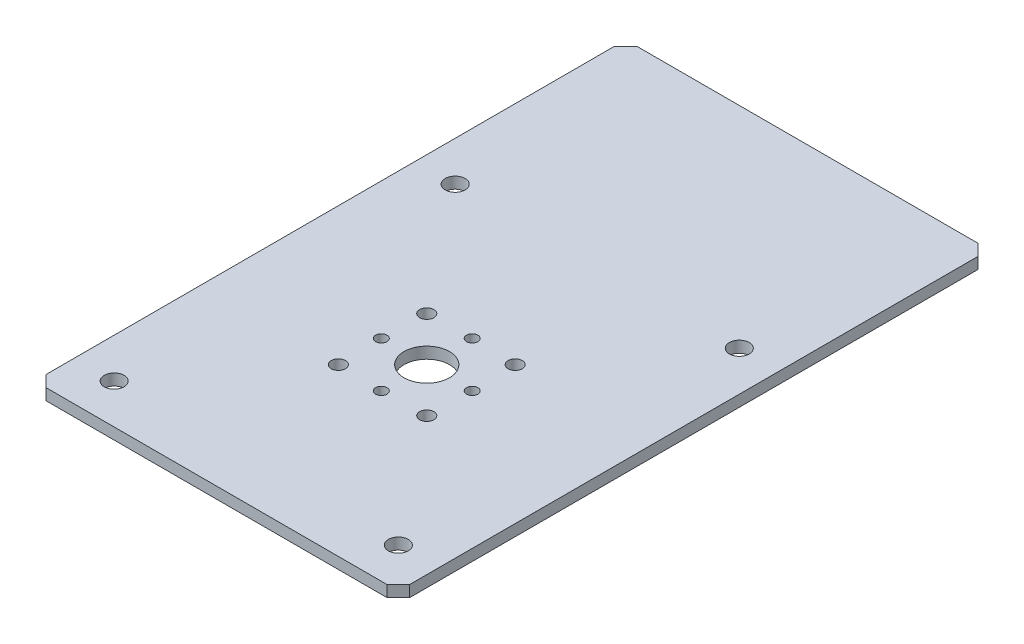
ISO-10303-21;
HEADER;
FILE_DESCRIPTION(('STEP AP214'),'2;1');
FILE_NAME('part.step','',(''),(''),'','','');
FILE_SCHEMA(('AUTOMOTIVE_DESIGN { 1 0 10303 214 1 1 1 1 }'));
ENDSEC;
DATA;
#1=APPLICATION_CONTEXT('core data for automotive mechanical design processes');
#2=APPLICATION_PROTOCOL_DEFINITION('international standard','automotive_design',2000,#1);
#3=PRODUCT_CONTEXT('',#1,'mechanical');
#4=PRODUCT('Part','Part','',(#3));
#5=PRODUCT_RELATED_PRODUCT_CATEGORY('part','',(#4));
#6=PRODUCT_DEFINITION_FORMATION('','',#4);
#7=PRODUCT_DEFINITION_CONTEXT('part definition',#1,'design');
#8=PRODUCT_DEFINITION('design','',#6,#7);
#9=PRODUCT_DEFINITION_SHAPE('','',#8);
#10=(LENGTH_UNIT() NAMED_UNIT(*) SI_UNIT(.MILLI.,.METRE.));
#11=(NAMED_UNIT(*) PLANE_ANGLE_UNIT() SI_UNIT($,.RADIAN.));
#12=(NAMED_UNIT(*) SI_UNIT($,.STERADIAN.) SOLID_ANGLE_UNIT());
#13=UNCERTAINTY_MEASURE_WITH_UNIT(LENGTH_MEASURE(1.E-05),#10,'distance_accuracy_value','');
#14=(GEOMETRIC_REPRESENTATION_CONTEXT(3) GLOBAL_UNCERTAINTY_ASSIGNED_CONTEXT((#13)) GLOBAL_UNIT_ASSIGNED_CONTEXT((#10,
#11,#12)) REPRESENTATION_CONTEXT('',''));
#15=CARTESIAN_POINT('',(0.,0.,0.));
#16=DIRECTION('',(0.,0.,1.));
#17=DIRECTION('',(1.,0.,0.));
#18=AXIS2_PLACEMENT_3D('',#15,#16,#17);
#19=CARTESIAN_POINT('',(-32.,-2.,74.));
#20=DIRECTION('',(0.,1.,0.));
#21=DIRECTION('',(0.,0.,1.));
#22=AXIS2_PLACEMENT_3D('',#19,#20,#21);
#23=PLANE('',#22);
#24=CARTESIAN_POINT('',(7.77817459305199,-2.,44.778174593052));
#25=DIRECTION('',(0.,1.,0.));
#26=DIRECTION('',(0.,0.,1.));
#27=AXIS2_PLACEMENT_3D('',#24,#25,#26);
#28=CIRCLE('',#27,1.25);
#29=CARTESIAN_POINT('',(7.77817459305199,-2.,46.028174593052));
#30=VERTEX_POINT('',#29);
#31=EDGE_CURVE('E167',#30,#30,#28,.F.);
#32=ORIENTED_EDGE('',*,*,#31,.F.);
#33=EDGE_LOOP('',(#32));
#34=FACE_BOUND('',#33,.T.);
#35=CARTESIAN_POINT('',(7.77817459305199,-2.,29.221825406948));
#36=DIRECTION('',(0.,1.,0.));
#37=DIRECTION('',(0.,0.,1.));
#38=AXIS2_PLACEMENT_3D('',#35,#36,#37);
#39=CIRCLE('',#38,1.25);
#40=CARTESIAN_POINT('',(7.77817459305199,-2.,30.471825406948));
#41=VERTEX_POINT('',#40);
#42=EDGE_CURVE('E173',#41,#41,#39,.F.);
#43=ORIENTED_EDGE('',*,*,#42,.F.);
#44=EDGE_LOOP('',(#43));
#45=FACE_BOUND('',#44,.T.);
#46=CARTESIAN_POINT('',(-7.77817459305201,-2.,29.221825406948));
#47=DIRECTION('',(0.,1.,0.));
#48=DIRECTION('',(0.,0.,1.));
#49=AXIS2_PLACEMENT_3D('',#46,#47,#48);
#50=CIRCLE('',#49,1.25);
#51=CARTESIAN_POINT('',(-7.77817459305201,-2.,30.471825406948));
#52=VERTEX_POINT('',#51);
#53=EDGE_CURVE('E179',#52,#52,#50,.F.);
#54=ORIENTED_EDGE('',*,*,#53,.F.);
#55=EDGE_LOOP('',(#54));
#56=FACE_BOUND('',#55,.T.);
#57=CARTESIAN_POINT('',(-7.77817459305201,-2.,44.778174593052));
#58=DIRECTION('',(0.,1.,0.));
#59=DIRECTION('',(0.,0.,1.));
#60=AXIS2_PLACEMENT_3D('',#57,#58,#59);
#61=CIRCLE('',#60,1.25);
#62=CARTESIAN_POINT('',(-7.77817459305201,-2.,46.028174593052));
#63=VERTEX_POINT('',#62);
#64=EDGE_CURVE('E185',#63,#63,#61,.F.);
#65=ORIENTED_EDGE('',*,*,#64,.F.);
#66=EDGE_LOOP('',(#65));
#67=FACE_BOUND('',#66,.T.);
#68=CARTESIAN_POINT('',(0.,-2.,29.));
#69=DIRECTION('',(0.,1.,0.));
#70=DIRECTION('',(0.,0.,1.));
#71=AXIS2_PLACEMENT_3D('',#68,#69,#70);
#72=CIRCLE('',#71,1.);
#73=CARTESIAN_POINT('',(0.,-2.,30.));
#74=VERTEX_POINT('',#73);
#75=EDGE_CURVE('E191',#74,#74,#72,.F.);
#76=ORIENTED_EDGE('',*,*,#75,.F.);
#77=EDGE_LOOP('',(#76));
#78=FACE_BOUND('',#77,.T.);
#79=CARTESIAN_POINT('',(0.,-2.,45.));
#80=DIRECTION('',(0.,1.,0.));
#81=DIRECTION('',(0.,0.,1.));
#82=AXIS2_PLACEMENT_3D('',#79,#80,#81);
#83=CIRCLE('',#82,0.999999999999992);
#84=CARTESIAN_POINT('',(0.,-2.,46.));
#85=VERTEX_POINT('',#84);
#86=EDGE_CURVE('E197',#85,#85,#83,.F.);
#87=ORIENTED_EDGE('',*,*,#86,.F.);
#88=EDGE_LOOP('',(#87));
#89=FACE_BOUND('',#88,.T.);
#90=CARTESIAN_POINT('',(7.99999999999999,-2.,37.));
#91=DIRECTION('',(0.,1.,0.));
#92=DIRECTION('',(0.,0.,1.));
#93=AXIS2_PLACEMENT_3D('',#90,#91,#92);
#94=CIRCLE('',#93,1.00000000000001);
#95=CARTESIAN_POINT('',(7.99999999999999,-2.,38.));
#96=VERTEX_POINT('',#95);
#97=EDGE_CURVE('E203',#96,#96,#94,.F.);
#98=ORIENTED_EDGE('',*,*,#97,.F.);
#99=EDGE_LOOP('',(#98));
#100=FACE_BOUND('',#99,.T.);
#101=CARTESIAN_POINT('',(-8.00000000000001,-2.,37.));
#102=DIRECTION('',(0.,1.,0.));
#103=DIRECTION('',(0.,0.,1.));
#104=AXIS2_PLACEMENT_3D('',#101,#102,#103);
#105=CIRCLE('',#104,1.00000000000001);
#106=CARTESIAN_POINT('',(-8.00000000000001,-2.,38.));
#107=VERTEX_POINT('',#106);
#108=EDGE_CURVE('E209',#107,#107,#105,.F.);
#109=ORIENTED_EDGE('',*,*,#108,.F.);
#110=EDGE_LOOP('',(#109));
#111=FACE_BOUND('',#110,.T.);
#112=CARTESIAN_POINT('',(0.,-2.,37.));
#113=DIRECTION('',(0.,1.,0.));
#114=DIRECTION('',(0.,0.,1.));
#115=AXIS2_PLACEMENT_3D('',#112,#113,#114);
#116=CIRCLE('',#115,4.00000000000001);
#117=CARTESIAN_POINT('',(0.,-2.,41.));
#118=VERTEX_POINT('',#117);
#119=EDGE_CURVE('E215',#118,#118,#116,.F.);
#120=ORIENTED_EDGE('',*,*,#119,.F.);
#121=EDGE_LOOP('',(#120));
#122=FACE_BOUND('',#121,.T.);
#123=CARTESIAN_POINT('',(25.,-2.,7.00000000000001));
#124=DIRECTION('',(0.,1.,0.));
#125=DIRECTION('',(0.,0.,1.));
#126=AXIS2_PLACEMENT_3D('',#123,#124,#125);
#127=CIRCLE('',#126,1.75);
#128=CARTESIAN_POINT('',(25.,-2.,8.75000000000001));
#129=VERTEX_POINT('',#128);
#130=EDGE_CURVE('E221',#129,#129,#127,.T.);
#131=ORIENTED_EDGE('',*,*,#130,.T.);
#132=EDGE_LOOP('',(#131));
#133=FACE_BOUND('',#132,.T.);
#134=CARTESIAN_POINT('',(25.,-2.,67.));
#135=DIRECTION('',(0.,1.,0.));
#136=DIRECTION('',(0.,0.,1.));
#137=AXIS2_PLACEMENT_3D('',#134,#135,#136);
#138=CIRCLE('',#137,1.75);
#139=CARTESIAN_POINT('',(25.,-2.,68.75));
#140=VERTEX_POINT('',#139);
#141=EDGE_CURVE('E227',#140,#140,#138,.T.);
#142=ORIENTED_EDGE('',*,*,#141,.T.);
#143=EDGE_LOOP('',(#142));
#144=FACE_BOUND('',#143,.T.);
#145=CARTESIAN_POINT('',(-25.,-2.,67.));
#146=DIRECTION('',(0.,1.,0.));
#147=DIRECTION('',(0.,0.,1.));
#148=AXIS2_PLACEMENT_3D('',#145,#146,#147);
#149=CIRCLE('',#148,1.75);
#150=CARTESIAN_POINT('',(-25.,-2.,68.75));
#151=VERTEX_POINT('',#150);
#152=EDGE_CURVE('E233',#151,#151,#149,.T.);
#153=ORIENTED_EDGE('',*,*,#152,.T.);
#154=EDGE_LOOP('',(#153));
#155=FACE_BOUND('',#154,.T.);
#156=CARTESIAN_POINT('',(-25.,-2.,7.00000000000001));
#157=DIRECTION('',(0.,1.,0.));
#158=DIRECTION('',(0.,0.,1.));
#159=AXIS2_PLACEMENT_3D('',#156,#157,#158);
#160=CIRCLE('',#159,1.75);
#161=CARTESIAN_POINT('',(-25.,-2.,8.75000000000001));
#162=VERTEX_POINT('',#161);
#163=EDGE_CURVE('E239',#162,#162,#160,.T.);
#164=ORIENTED_EDGE('',*,*,#163,.T.);
#165=EDGE_LOOP('',(#164));
#166=FACE_BOUND('',#165,.T.);
#167=DIRECTION('',(-1.,0.,0.));
#168=VECTOR('',#167,1.);
#169=CARTESIAN_POINT('',(-32.,-2.,-30.));
#170=LINE('',#169,#168);
#171=CARTESIAN_POINT('',(30.,-2.,-30.));
#172=VERTEX_POINT('',#171);
#173=CARTESIAN_POINT('',(-30.,-2.,-30.));
#174=VERTEX_POINT('',#173);
#175=EDGE_CURVE('E151',#172,#174,#170,.T.);
#176=ORIENTED_EDGE('',*,*,#175,.F.);
#177=DIRECTION('',(-0.707106781186548,0.,-0.707106781186548));
#178=VECTOR('',#177,1.);
#179=CARTESIAN_POINT('',(32.,-2.,-28.));
#180=LINE('',#179,#178);
#181=CARTESIAN_POINT('',(32.,-2.,-28.));
#182=VERTEX_POINT('',#181);
#183=EDGE_CURVE('E42',#172,#182,#180,.F.);
#184=ORIENTED_EDGE('',*,*,#183,.T.);
#185=DIRECTION('',(0.,0.,-1.));
#186=VECTOR('',#185,1.);
#187=CARTESIAN_POINT('',(32.,-2.,74.));
#188=LINE('',#187,#186);
#189=CARTESIAN_POINT('',(32.,-2.,72.));
#190=VERTEX_POINT('',#189);
#191=EDGE_CURVE('E122',#190,#182,#188,.T.);
#192=ORIENTED_EDGE('',*,*,#191,.F.);
#193=DIRECTION('',(-0.70710678118655,0.,0.707106781186545));
#194=VECTOR('',#193,1.);
#195=CARTESIAN_POINT('',(32.,-2.,72.));
#196=LINE('',#195,#194);
#197=CARTESIAN_POINT('',(30.,-2.,74.));
#198=VERTEX_POINT('',#197);
#199=EDGE_CURVE('E126',#190,#198,#196,.T.);
#200=ORIENTED_EDGE('',*,*,#199,.T.);
#201=DIRECTION('',(1.,0.,0.));
#202=VECTOR('',#201,1.);
#203=CARTESIAN_POINT('',(-32.,-2.,74.));
#204=LINE('',#203,#202);
#205=CARTESIAN_POINT('',(-30.,-2.,74.));
#206=VERTEX_POINT('',#205);
#207=EDGE_CURVE('E242',#206,#198,#204,.T.);
#208=ORIENTED_EDGE('',*,*,#207,.F.);
#209=DIRECTION('',(-0.70710678118655,0.,-0.707106781186545));
#210=VECTOR('',#209,1.);
#211=CARTESIAN_POINT('',(-32.,-2.,72.));
#212=LINE('',#211,#210);
#213=CARTESIAN_POINT('',(-32.,-2.,72.));
#214=VERTEX_POINT('',#213);
#215=EDGE_CURVE('E127',#206,#214,#212,.T.);
#216=ORIENTED_EDGE('',*,*,#215,.T.);
#217=DIRECTION('',(0.,0.,-1.));
#218=VECTOR('',#217,1.);
#219=CARTESIAN_POINT('',(-32.,-2.,74.));
#220=LINE('',#219,#218);
#221=CARTESIAN_POINT('',(-32.,-2.,-28.));
#222=VERTEX_POINT('',#221);
#223=EDGE_CURVE('E246',#214,#222,#220,.T.);
#224=ORIENTED_EDGE('',*,*,#223,.T.);
#225=DIRECTION('',(-0.707106781186548,0.,0.707106781186548));
#226=VECTOR('',#225,1.);
#227=CARTESIAN_POINT('',(-30.,-2.,-30.));
#228=LINE('',#227,#226);
#229=EDGE_CURVE('E54',#222,#174,#228,.F.);
#230=ORIENTED_EDGE('',*,*,#229,.T.);
#231=EDGE_LOOP('',(#176,#184,#192,#200,#208,#216,#224,#230));
#232=FACE_BOUND('',#231,.T.);
#233=ADVANCED_FACE('F34',(#34,#45,#56,#67,#78,#89,#100,#111,#122,#133,#144,#155,#166,#232),#23,.F.);
#234=CARTESIAN_POINT('',(32.,0.,74.));
#235=DIRECTION('',(1.,0.,0.));
#236=DIRECTION('',(0.,0.,-1.));
#237=AXIS2_PLACEMENT_3D('',#234,#235,#236);
#238=PLANE('',#237);
#239=ORIENTED_EDGE('',*,*,#191,.T.);
#240=DIRECTION('',(0.,1.,0.));
#241=VECTOR('',#240,1.);
#242=CARTESIAN_POINT('',(32.,0.,-28.));
#243=LINE('',#242,#241);
#244=CARTESIAN_POINT('',(32.,0.,-28.));
#245=VERTEX_POINT('',#244);
#246=EDGE_CURVE('E121',#182,#245,#243,.T.);
#247=ORIENTED_EDGE('',*,*,#246,.T.);
#248=DIRECTION('',(0.,0.,-1.));
#249=VECTOR('',#248,1.);
#250=CARTESIAN_POINT('',(32.,0.,74.));
#251=LINE('',#250,#249);
#252=CARTESIAN_POINT('',(32.,0.,72.));
#253=VERTEX_POINT('',#252);
#254=EDGE_CURVE('E104',#253,#245,#251,.T.);
#255=ORIENTED_EDGE('',*,*,#254,.F.);
#256=DIRECTION('',(0.,-1.,0.));
#257=VECTOR('',#256,1.);
#258=CARTESIAN_POINT('',(32.,-2.,72.));
#259=LINE('',#258,#257);
#260=EDGE_CURVE('E118',#253,#190,#259,.T.);
#261=ORIENTED_EDGE('',*,*,#260,.T.);
#262=EDGE_LOOP('',(#239,#247,#255,#261));
#263=FACE_BOUND('',#262,.T.);
#264=ADVANCED_FACE('F117',(#263),#238,.T.);
#265=CARTESIAN_POINT('',(-32.,0.,74.));
#266=DIRECTION('',(0.,1.,0.));
#267=DIRECTION('',(0.,0.,1.));
#268=AXIS2_PLACEMENT_3D('',#265,#266,#267);
#269=PLANE('',#268);
#270=CARTESIAN_POINT('',(7.77817459305199,0.,44.778174593052));
#271=DIRECTION('',(0.,1.,0.));
#272=DIRECTION('',(0.,0.,1.));
#273=AXIS2_PLACEMENT_3D('',#270,#271,#272);
#274=CIRCLE('',#273,1.25);
#275=CARTESIAN_POINT('',(7.77817459305199,0.,46.028174593052));
#276=VERTEX_POINT('',#275);
#277=EDGE_CURVE('E162',#276,#276,#274,.T.);
#278=ORIENTED_EDGE('',*,*,#277,.F.);
#279=EDGE_LOOP('',(#278));
#280=FACE_BOUND('',#279,.T.);
#281=CARTESIAN_POINT('',(7.77817459305199,0.,29.221825406948));
#282=DIRECTION('',(0.,1.,0.));
#283=DIRECTION('',(0.,0.,1.));
#284=AXIS2_PLACEMENT_3D('',#281,#282,#283);
#285=CIRCLE('',#284,1.25);
#286=CARTESIAN_POINT('',(7.77817459305199,0.,30.471825406948));
#287=VERTEX_POINT('',#286);
#288=EDGE_CURVE('E170',#287,#287,#285,.T.);
#289=ORIENTED_EDGE('',*,*,#288,.F.);
#290=EDGE_LOOP('',(#289));
#291=FACE_BOUND('',#290,.T.);
#292=CARTESIAN_POINT('',(-7.77817459305201,0.,29.221825406948));
#293=DIRECTION('',(0.,1.,0.));
#294=DIRECTION('',(0.,0.,1.));
#295=AXIS2_PLACEMENT_3D('',#292,#293,#294);
#296=CIRCLE('',#295,1.25);
#297=CARTESIAN_POINT('',(-7.77817459305201,0.,30.471825406948));
#298=VERTEX_POINT('',#297);
#299=EDGE_CURVE('E176',#298,#298,#296,.T.);
#300=ORIENTED_EDGE('',*,*,#299,.F.);
#301=EDGE_LOOP('',(#300));
#302=FACE_BOUND('',#301,.T.);
#303=CARTESIAN_POINT('',(-7.77817459305201,0.,44.778174593052));
#304=DIRECTION('',(0.,1.,0.));
#305=DIRECTION('',(0.,0.,1.));
#306=AXIS2_PLACEMENT_3D('',#303,#304,#305);
#307=CIRCLE('',#306,1.25);
#308=CARTESIAN_POINT('',(-7.77817459305201,0.,46.028174593052));
#309=VERTEX_POINT('',#308);
#310=EDGE_CURVE('E182',#309,#309,#307,.T.);
#311=ORIENTED_EDGE('',*,*,#310,.F.);
#312=EDGE_LOOP('',(#311));
#313=FACE_BOUND('',#312,.T.);
#314=CARTESIAN_POINT('',(0.,0.,29.));
#315=DIRECTION('',(0.,1.,0.));
#316=DIRECTION('',(0.,0.,1.));
#317=AXIS2_PLACEMENT_3D('',#314,#315,#316);
#318=CIRCLE('',#317,1.);
#319=CARTESIAN_POINT('',(0.,0.,30.));
#320=VERTEX_POINT('',#319);
#321=EDGE_CURVE('E188',#320,#320,#318,.T.);
#322=ORIENTED_EDGE('',*,*,#321,.F.);
#323=EDGE_LOOP('',(#322));
#324=FACE_BOUND('',#323,.T.);
#325=CARTESIAN_POINT('',(0.,0.,45.));
#326=DIRECTION('',(0.,1.,0.));
#327=DIRECTION('',(0.,0.,1.));
#328=AXIS2_PLACEMENT_3D('',#325,#326,#327);
#329=CIRCLE('',#328,0.999999999999992);
#330=CARTESIAN_POINT('',(0.,0.,46.));
#331=VERTEX_POINT('',#330);
#332=EDGE_CURVE('E194',#331,#331,#329,.T.);
#333=ORIENTED_EDGE('',*,*,#332,.F.);
#334=EDGE_LOOP('',(#333));
#335=FACE_BOUND('',#334,.T.);
#336=CARTESIAN_POINT('',(7.99999999999999,0.,37.));
#337=DIRECTION('',(0.,1.,0.));
#338=DIRECTION('',(0.,0.,1.));
#339=AXIS2_PLACEMENT_3D('',#336,#337,#338);
#340=CIRCLE('',#339,1.00000000000001);
#341=CARTESIAN_POINT('',(7.99999999999999,0.,38.));
#342=VERTEX_POINT('',#341);
#343=EDGE_CURVE('E200',#342,#342,#340,.T.);
#344=ORIENTED_EDGE('',*,*,#343,.F.);
#345=EDGE_LOOP('',(#344));
#346=FACE_BOUND('',#345,.T.);
#347=CARTESIAN_POINT('',(-8.00000000000001,0.,37.));
#348=DIRECTION('',(0.,1.,0.));
#349=DIRECTION('',(0.,0.,1.));
#350=AXIS2_PLACEMENT_3D('',#347,#348,#349);
#351=CIRCLE('',#350,1.00000000000001);
#352=CARTESIAN_POINT('',(-8.00000000000001,0.,38.));
#353=VERTEX_POINT('',#352);
#354=EDGE_CURVE('E206',#353,#353,#351,.T.);
#355=ORIENTED_EDGE('',*,*,#354,.F.);
#356=EDGE_LOOP('',(#355));
#357=FACE_BOUND('',#356,.T.);
#358=CARTESIAN_POINT('',(0.,0.,37.));
#359=DIRECTION('',(0.,1.,0.));
#360=DIRECTION('',(0.,0.,1.));
#361=AXIS2_PLACEMENT_3D('',#358,#359,#360);
#362=CIRCLE('',#361,4.00000000000001);
#363=CARTESIAN_POINT('',(0.,0.,41.));
#364=VERTEX_POINT('',#363);
#365=EDGE_CURVE('E212',#364,#364,#362,.T.);
#366=ORIENTED_EDGE('',*,*,#365,.F.);
#367=EDGE_LOOP('',(#366));
#368=FACE_BOUND('',#367,.T.);
#369=CARTESIAN_POINT('',(25.,0.,7.00000000000001));
#370=DIRECTION('',(0.,1.,0.));
#371=DIRECTION('',(0.,0.,-1.));
#372=AXIS2_PLACEMENT_3D('',#369,#370,#371);
#373=CIRCLE('',#372,1.75);
#374=CARTESIAN_POINT('',(25.,0.,5.25000000000001));
#375=VERTEX_POINT('',#374);
#376=EDGE_CURVE('E218',#375,#375,#373,.T.);
#377=ORIENTED_EDGE('',*,*,#376,.F.);
#378=EDGE_LOOP('',(#377));
#379=FACE_BOUND('',#378,.T.);
#380=CARTESIAN_POINT('',(25.,0.,67.));
#381=DIRECTION('',(0.,1.,0.));
#382=DIRECTION('',(0.,0.,1.));
#383=AXIS2_PLACEMENT_3D('',#380,#381,#382);
#384=CIRCLE('',#383,1.75);
#385=CARTESIAN_POINT('',(25.,0.,68.75));
#386=VERTEX_POINT('',#385);
#387=EDGE_CURVE('E224',#386,#386,#384,.T.);
#388=ORIENTED_EDGE('',*,*,#387,.F.);
#389=EDGE_LOOP('',(#388));
#390=FACE_BOUND('',#389,.T.);
#391=CARTESIAN_POINT('',(-25.,0.,67.));
#392=DIRECTION('',(0.,1.,0.));
#393=DIRECTION('',(0.,0.,-1.));
#394=AXIS2_PLACEMENT_3D('',#391,#392,#393);
#395=CIRCLE('',#394,1.75);
#396=CARTESIAN_POINT('',(-25.,0.,65.25));
#397=VERTEX_POINT('',#396);
#398=EDGE_CURVE('E230',#397,#397,#395,.T.);
#399=ORIENTED_EDGE('',*,*,#398,.F.);
#400=EDGE_LOOP('',(#399));
#401=FACE_BOUND('',#400,.T.);
#402=CARTESIAN_POINT('',(-25.,0.,7.00000000000001));
#403=DIRECTION('',(0.,1.,0.));
#404=DIRECTION('',(0.,0.,1.));
#405=AXIS2_PLACEMENT_3D('',#402,#403,#404);
#406=CIRCLE('',#405,1.75);
#407=CARTESIAN_POINT('',(-25.,0.,8.75000000000001));
#408=VERTEX_POINT('',#407);
#409=EDGE_CURVE('E236',#408,#408,#406,.T.);
#410=ORIENTED_EDGE('',*,*,#409,.F.);
#411=EDGE_LOOP('',(#410));
#412=FACE_BOUND('',#411,.T.);
#413=ORIENTED_EDGE('',*,*,#254,.T.);
#414=DIRECTION('',(0.707106781186548,0.,0.707106781186548));
#415=VECTOR('',#414,1.);
#416=CARTESIAN_POINT('',(51.,0.,-9.00000000000001));
#417=LINE('',#416,#415);
#418=CARTESIAN_POINT('',(30.,0.,-30.));
#419=VERTEX_POINT('',#418);
#420=EDGE_CURVE('E143',#245,#419,#417,.F.);
#421=ORIENTED_EDGE('',*,*,#420,.T.);
#422=DIRECTION('',(-1.,0.,0.));
#423=VECTOR('',#422,1.);
#424=CARTESIAN_POINT('',(-32.,0.,-30.));
#425=LINE('',#424,#423);
#426=CARTESIAN_POINT('',(-30.,0.,-30.));
#427=VERTEX_POINT('',#426);
#428=EDGE_CURVE('E157',#419,#427,#425,.T.);
#429=ORIENTED_EDGE('',*,*,#428,.T.);
#430=DIRECTION('',(0.707106781186548,0.,-0.707106781186548));
#431=VECTOR('',#430,1.);
#432=CARTESIAN_POINT('',(-83.,0.,23.));
#433=LINE('',#432,#431);
#434=CARTESIAN_POINT('',(-32.,0.,-28.));
#435=VERTEX_POINT('',#434);
#436=EDGE_CURVE('E141',#427,#435,#433,.F.);
#437=ORIENTED_EDGE('',*,*,#436,.T.);
#438=DIRECTION('',(0.,0.,-1.));
#439=VECTOR('',#438,1.);
#440=CARTESIAN_POINT('',(-32.,0.,74.));
#441=LINE('',#440,#439);
#442=CARTESIAN_POINT('',(-32.,0.,72.));
#443=VERTEX_POINT('',#442);
#444=EDGE_CURVE('E123',#443,#435,#441,.T.);
#445=ORIENTED_EDGE('',*,*,#444,.F.);
#446=DIRECTION('',(0.70710678118655,0.,0.707106781186545));
#447=VECTOR('',#446,1.);
#448=CARTESIAN_POINT('',(-31.,0.,73.));
#449=LINE('',#448,#447);
#450=CARTESIAN_POINT('',(-30.,0.,74.));
#451=VERTEX_POINT('',#450);
#452=EDGE_CURVE('E111',#443,#451,#449,.T.);
#453=ORIENTED_EDGE('',*,*,#452,.T.);
#454=DIRECTION('',(1.,0.,0.));
#455=VECTOR('',#454,1.);
#456=CARTESIAN_POINT('',(-32.,0.,74.));
#457=LINE('',#456,#455);
#458=CARTESIAN_POINT('',(30.,0.,74.));
#459=VERTEX_POINT('',#458);
#460=EDGE_CURVE('E106',#451,#459,#457,.T.);
#461=ORIENTED_EDGE('',*,*,#460,.T.);
#462=DIRECTION('',(0.70710678118655,0.,-0.707106781186545));
#463=VECTOR('',#462,1.);
#464=CARTESIAN_POINT('',(-1.00000000000023,0.,105.));
#465=LINE('',#464,#463);
#466=EDGE_CURVE('E101',#459,#253,#465,.T.);
#467=ORIENTED_EDGE('',*,*,#466,.T.);
#468=EDGE_LOOP('',(#413,#421,#429,#437,#445,#453,#461,#467));
#469=FACE_BOUND('',#468,.T.);
#470=ADVANCED_FACE('F103',(#280,#291,#302,#313,#324,#335,#346,#357,#368,#379,#390,#401,#412,
#469),#269,.T.);
#471=CARTESIAN_POINT('',(-32.,-2.,74.));
#472=DIRECTION('',(-1.,0.,0.));
#473=DIRECTION('',(0.,0.,1.));
#474=AXIS2_PLACEMENT_3D('',#471,#472,#473);
#475=PLANE('',#474);
#476=ORIENTED_EDGE('',*,*,#444,.T.);
#477=DIRECTION('',(0.,-1.,0.));
#478=VECTOR('',#477,1.);
#479=CARTESIAN_POINT('',(-32.,-2.,-28.));
#480=LINE('',#479,#478);
#481=EDGE_CURVE('E11',#435,#222,#480,.T.);
#482=ORIENTED_EDGE('',*,*,#481,.T.);
#483=ORIENTED_EDGE('',*,*,#223,.F.);
#484=DIRECTION('',(0.,1.,0.));
#485=VECTOR('',#484,1.);
#486=CARTESIAN_POINT('',(-32.,0.,72.));
#487=LINE('',#486,#485);
#488=EDGE_CURVE('E110',#214,#443,#487,.T.);
#489=ORIENTED_EDGE('',*,*,#488,.T.);
#490=EDGE_LOOP('',(#476,#482,#483,#489));
#491=FACE_BOUND('',#490,.T.);
#492=ADVANCED_FACE('F249',(#491),#475,.T.);
#493=CARTESIAN_POINT('',(32.,-2.,74.));
#494=DIRECTION('',(0.,0.,-1.));
#495=DIRECTION('',(-1.,0.,0.));
#496=AXIS2_PLACEMENT_3D('',#493,#494,#495);
#497=PLANE('',#496);
#498=ORIENTED_EDGE('',*,*,#207,.T.);
#499=DIRECTION('',(0.,1.,0.));
#500=VECTOR('',#499,1.);
#501=CARTESIAN_POINT('',(30.,0.,74.));
#502=LINE('',#501,#500);
#503=EDGE_CURVE('E135',#198,#459,#502,.T.);
#504=ORIENTED_EDGE('',*,*,#503,.T.);
#505=ORIENTED_EDGE('',*,*,#460,.F.);
#506=DIRECTION('',(0.,-1.,0.));
#507=VECTOR('',#506,1.);
#508=CARTESIAN_POINT('',(-30.,-2.,74.));
#509=LINE('',#508,#507);
#510=EDGE_CURVE('E133',#451,#206,#509,.T.);
#511=ORIENTED_EDGE('',*,*,#510,.T.);
#512=EDGE_LOOP('',(#498,#504,#505,#511));
#513=FACE_BOUND('',#512,.T.);
#514=ADVANCED_FACE('F284',(#513),#497,.F.);
#515=CARTESIAN_POINT('',(-25.,-10.,7.00000000000001));
#516=DIRECTION('',(0.,1.,0.));
#517=DIRECTION('',(0.,0.,1.));
#518=AXIS2_PLACEMENT_3D('',#515,#516,#517);
#519=CYLINDRICAL_SURFACE('',#518,1.75);
#520=ORIENTED_EDGE('',*,*,#409,.T.);
#521=EDGE_LOOP('',(#520));
#522=FACE_BOUND('',#521,.T.);
#523=ORIENTED_EDGE('',*,*,#163,.F.);
#524=EDGE_LOOP('',(#523));
#525=FACE_BOUND('',#524,.T.);
#526=ADVANCED_FACE('F286',(#522,#525),#519,.F.);
#527=CARTESIAN_POINT('',(-25.,-10.,67.));
#528=DIRECTION('',(0.,1.,0.));
#529=DIRECTION('',(0.,0.,1.));
#530=AXIS2_PLACEMENT_3D('',#527,#528,#529);
#531=CYLINDRICAL_SURFACE('',#530,1.75);
#532=ORIENTED_EDGE('',*,*,#398,.T.);
#533=EDGE_LOOP('',(#532));
#534=FACE_BOUND('',#533,.T.);
#535=ORIENTED_EDGE('',*,*,#152,.F.);
#536=EDGE_LOOP('',(#535));
#537=FACE_BOUND('',#536,.T.);
#538=ADVANCED_FACE('F292',(#534,#537),#531,.F.);
#539=CARTESIAN_POINT('',(25.,-10.,67.));
#540=DIRECTION('',(0.,1.,0.));
#541=DIRECTION('',(0.,0.,1.));
#542=AXIS2_PLACEMENT_3D('',#539,#540,#541);
#543=CYLINDRICAL_SURFACE('',#542,1.75);
#544=ORIENTED_EDGE('',*,*,#387,.T.);
#545=EDGE_LOOP('',(#544));
#546=FACE_BOUND('',#545,.T.);
#547=ORIENTED_EDGE('',*,*,#141,.F.);
#548=EDGE_LOOP('',(#547));
#549=FACE_BOUND('',#548,.T.);
#550=ADVANCED_FACE('F332',(#546,#549),#543,.F.);
#551=CARTESIAN_POINT('',(25.,-10.,7.00000000000001));
#552=DIRECTION('',(0.,1.,0.));
#553=DIRECTION('',(0.,0.,1.));
#554=AXIS2_PLACEMENT_3D('',#551,#552,#553);
#555=CYLINDRICAL_SURFACE('',#554,1.75);
#556=ORIENTED_EDGE('',*,*,#376,.T.);
#557=EDGE_LOOP('',(#556));
#558=FACE_BOUND('',#557,.T.);
#559=ORIENTED_EDGE('',*,*,#130,.F.);
#560=EDGE_LOOP('',(#559));
#561=FACE_BOUND('',#560,.T.);
#562=ADVANCED_FACE('F338',(#558,#561),#555,.F.);
#563=CARTESIAN_POINT('',(0.,-2.001,37.));
#564=DIRECTION('',(0.,1.,0.));
#565=DIRECTION('',(0.,0.,1.));
#566=AXIS2_PLACEMENT_3D('',#563,#564,#565);
#567=CYLINDRICAL_SURFACE('',#566,4.00000000000001);
#568=ORIENTED_EDGE('',*,*,#365,.T.);
#569=EDGE_LOOP('',(#568));
#570=FACE_BOUND('',#569,.T.);
#571=ORIENTED_EDGE('',*,*,#119,.T.);
#572=EDGE_LOOP('',(#571));
#573=FACE_BOUND('',#572,.T.);
#574=ADVANCED_FACE('F270',(#570,#573),#567,.F.);
#575=CARTESIAN_POINT('',(32.,0.,72.));
#576=DIRECTION('',(0.707106781186545,0.,0.70710678118655));
#577=DIRECTION('',(0.70710678118655,0.,-0.707106781186545));
#578=AXIS2_PLACEMENT_3D('',#575,#576,#577);
#579=PLANE('',#578);
#580=ORIENTED_EDGE('',*,*,#466,.F.);
#581=ORIENTED_EDGE('',*,*,#503,.F.);
#582=ORIENTED_EDGE('',*,*,#199,.F.);
#583=ORIENTED_EDGE('',*,*,#260,.F.);
#584=EDGE_LOOP('',(#580,#581,#582,#583));
#585=FACE_BOUND('',#584,.T.);
#586=ADVANCED_FACE('F125',(#585),#579,.T.);
#587=CARTESIAN_POINT('',(-32.,-2.,72.));
#588=DIRECTION('',(-0.707106781186545,0.,0.70710678118655));
#589=DIRECTION('',(0.70710678118655,0.,0.707106781186545));
#590=AXIS2_PLACEMENT_3D('',#587,#588,#589);
#591=PLANE('',#590);
#592=ORIENTED_EDGE('',*,*,#215,.F.);
#593=ORIENTED_EDGE('',*,*,#510,.F.);
#594=ORIENTED_EDGE('',*,*,#452,.F.);
#595=ORIENTED_EDGE('',*,*,#488,.F.);
#596=EDGE_LOOP('',(#592,#593,#594,#595));
#597=FACE_BOUND('',#596,.T.);
#598=ADVANCED_FACE('F269',(#597),#591,.T.);
#599=CARTESIAN_POINT('',(-8.00000000000001,-2.001,37.));
#600=DIRECTION('',(0.,1.,0.));
#601=DIRECTION('',(0.,0.,1.));
#602=AXIS2_PLACEMENT_3D('',#599,#600,#601);
#603=CYLINDRICAL_SURFACE('',#602,1.00000000000001);
#604=ORIENTED_EDGE('',*,*,#354,.T.);
#605=EDGE_LOOP('',(#604));
#606=FACE_BOUND('',#605,.T.);
#607=ORIENTED_EDGE('',*,*,#108,.T.);
#608=EDGE_LOOP('',(#607));
#609=FACE_BOUND('',#608,.T.);
#610=ADVANCED_FACE('F272',(#606,#609),#603,.F.);
#611=CARTESIAN_POINT('',(7.99999999999999,-2.001,37.));
#612=DIRECTION('',(0.,1.,0.));
#613=DIRECTION('',(0.,0.,1.));
#614=AXIS2_PLACEMENT_3D('',#611,#612,#613);
#615=CYLINDRICAL_SURFACE('',#614,1.00000000000001);
#616=ORIENTED_EDGE('',*,*,#343,.T.);
#617=EDGE_LOOP('',(#616));
#618=FACE_BOUND('',#617,.T.);
#619=ORIENTED_EDGE('',*,*,#97,.T.);
#620=EDGE_LOOP('',(#619));
#621=FACE_BOUND('',#620,.T.);
#622=ADVANCED_FACE('F277',(#618,#621),#615,.F.);
#623=CARTESIAN_POINT('',(0.,-2.001,45.));
#624=DIRECTION('',(0.,1.,0.));
#625=DIRECTION('',(0.,0.,1.));
#626=AXIS2_PLACEMENT_3D('',#623,#624,#625);
#627=CYLINDRICAL_SURFACE('',#626,0.999999999999992);
#628=ORIENTED_EDGE('',*,*,#332,.T.);
#629=EDGE_LOOP('',(#628));
#630=FACE_BOUND('',#629,.T.);
#631=ORIENTED_EDGE('',*,*,#86,.T.);
#632=EDGE_LOOP('',(#631));
#633=FACE_BOUND('',#632,.T.);
#634=ADVANCED_FACE('F350',(#630,#633),#627,.F.);
#635=CARTESIAN_POINT('',(0.,-2.001,29.));
#636=DIRECTION('',(0.,1.,0.));
#637=DIRECTION('',(0.,0.,1.));
#638=AXIS2_PLACEMENT_3D('',#635,#636,#637);
#639=CYLINDRICAL_SURFACE('',#638,1.);
#640=ORIENTED_EDGE('',*,*,#321,.T.);
#641=EDGE_LOOP('',(#640));
#642=FACE_BOUND('',#641,.T.);
#643=ORIENTED_EDGE('',*,*,#75,.T.);
#644=EDGE_LOOP('',(#643));
#645=FACE_BOUND('',#644,.T.);
#646=ADVANCED_FACE('F354',(#642,#645),#639,.F.);
#647=CARTESIAN_POINT('',(-7.77817459305201,-2.001,44.778174593052));
#648=DIRECTION('',(0.,1.,0.));
#649=DIRECTION('',(0.,0.,1.));
#650=AXIS2_PLACEMENT_3D('',#647,#648,#649);
#651=CYLINDRICAL_SURFACE('',#650,1.25);
#652=ORIENTED_EDGE('',*,*,#310,.T.);
#653=EDGE_LOOP('',(#652));
#654=FACE_BOUND('',#653,.T.);
#655=ORIENTED_EDGE('',*,*,#64,.T.);
#656=EDGE_LOOP('',(#655));
#657=FACE_BOUND('',#656,.T.);
#658=ADVANCED_FACE('F358',(#654,#657),#651,.F.);
#659=CARTESIAN_POINT('',(-7.77817459305201,-2.001,29.221825406948));
#660=DIRECTION('',(0.,1.,0.));
#661=DIRECTION('',(0.,0.,1.));
#662=AXIS2_PLACEMENT_3D('',#659,#660,#661);
#663=CYLINDRICAL_SURFACE('',#662,1.25);
#664=ORIENTED_EDGE('',*,*,#299,.T.);
#665=EDGE_LOOP('',(#664));
#666=FACE_BOUND('',#665,.T.);
#667=ORIENTED_EDGE('',*,*,#53,.T.);
#668=EDGE_LOOP('',(#667));
#669=FACE_BOUND('',#668,.T.);
#670=ADVANCED_FACE('F362',(#666,#669),#663,.F.);
#671=CARTESIAN_POINT('',(7.77817459305199,-2.001,29.221825406948));
#672=DIRECTION('',(0.,1.,0.));
#673=DIRECTION('',(0.,0.,1.));
#674=AXIS2_PLACEMENT_3D('',#671,#672,#673);
#675=CYLINDRICAL_SURFACE('',#674,1.25);
#676=ORIENTED_EDGE('',*,*,#288,.T.);
#677=EDGE_LOOP('',(#676));
#678=FACE_BOUND('',#677,.T.);
#679=ORIENTED_EDGE('',*,*,#42,.T.);
#680=EDGE_LOOP('',(#679));
#681=FACE_BOUND('',#680,.T.);
#682=ADVANCED_FACE('F366',(#678,#681),#675,.F.);
#683=CARTESIAN_POINT('',(7.77817459305199,-2.001,44.778174593052));
#684=DIRECTION('',(0.,1.,0.));
#685=DIRECTION('',(0.,0.,1.));
#686=AXIS2_PLACEMENT_3D('',#683,#684,#685);
#687=CYLINDRICAL_SURFACE('',#686,1.25);
#688=ORIENTED_EDGE('',*,*,#277,.T.);
#689=EDGE_LOOP('',(#688));
#690=FACE_BOUND('',#689,.T.);
#691=ORIENTED_EDGE('',*,*,#31,.T.);
#692=EDGE_LOOP('',(#691));
#693=FACE_BOUND('',#692,.T.);
#694=ADVANCED_FACE('F370',(#690,#693),#687,.F.);
#695=CARTESIAN_POINT('',(-32.,-2.,-30.));
#696=DIRECTION('',(0.,0.,-1.));
#697=DIRECTION('',(-1.,0.,0.));
#698=AXIS2_PLACEMENT_3D('',#695,#696,#697);
#699=PLANE('',#698);
#700=ORIENTED_EDGE('',*,*,#428,.F.);
#701=DIRECTION('',(0.,-1.,0.));
#702=VECTOR('',#701,1.);
#703=CARTESIAN_POINT('',(30.,-2.,-30.));
#704=LINE('',#703,#702);
#705=EDGE_CURVE('E148',#419,#172,#704,.T.);
#706=ORIENTED_EDGE('',*,*,#705,.T.);
#707=ORIENTED_EDGE('',*,*,#175,.T.);
#708=DIRECTION('',(0.,1.,0.));
#709=VECTOR('',#708,1.);
#710=CARTESIAN_POINT('',(-30.,-2.,-30.));
#711=LINE('',#710,#709);
#712=EDGE_CURVE('E145',#174,#427,#711,.T.);
#713=ORIENTED_EDGE('',*,*,#712,.T.);
#714=EDGE_LOOP('',(#700,#706,#707,#713));
#715=FACE_BOUND('',#714,.T.);
#716=ADVANCED_FACE('F159',(#715),#699,.T.);
#717=CARTESIAN_POINT('',(32.,0.,-28.));
#718=DIRECTION('',(-0.707106781186547,0.,0.707106781186547));
#719=DIRECTION('',(0.707106781186548,0.,0.707106781186548));
#720=AXIS2_PLACEMENT_3D('',#717,#718,#719);
#721=PLANE('',#720);
#722=ORIENTED_EDGE('',*,*,#183,.F.);
#723=ORIENTED_EDGE('',*,*,#705,.F.);
#724=ORIENTED_EDGE('',*,*,#420,.F.);
#725=ORIENTED_EDGE('',*,*,#246,.F.);
#726=EDGE_LOOP('',(#722,#723,#724,#725));
#727=FACE_BOUND('',#726,.T.);
#728=ADVANCED_FACE('F154',(#727),#721,.F.);
#729=CARTESIAN_POINT('',(-30.,-2.,-30.));
#730=DIRECTION('',(0.707106781186547,0.,0.707106781186547));
#731=DIRECTION('',(0.707106781186548,0.,-0.707106781186548));
#732=AXIS2_PLACEMENT_3D('',#729,#730,#731);
#733=PLANE('',#732);
#734=ORIENTED_EDGE('',*,*,#229,.F.);
#735=ORIENTED_EDGE('',*,*,#481,.F.);
#736=ORIENTED_EDGE('',*,*,#436,.F.);
#737=ORIENTED_EDGE('',*,*,#712,.F.);
#738=EDGE_LOOP('',(#734,#735,#736,#737));
#739=FACE_BOUND('',#738,.T.);
#740=ADVANCED_FACE('F36',(#739),#733,.F.);
#741=CLOSED_SHELL('',(#233,#264,#470,#492,#514,#526,#538,#550,#562,#574,#586,#598,#610,#622,
#634,#646,#658,#670,#682,#694,#716,#728,#740));
#742=MANIFOLD_SOLID_BREP('B2',#741);
#743=ADVANCED_BREP_SHAPE_REPRESENTATION('',(#18,#742),#14);
#744=SHAPE_DEFINITION_REPRESENTATION(#9,#743);
ENDSEC;
END-ISO-10303-21;
